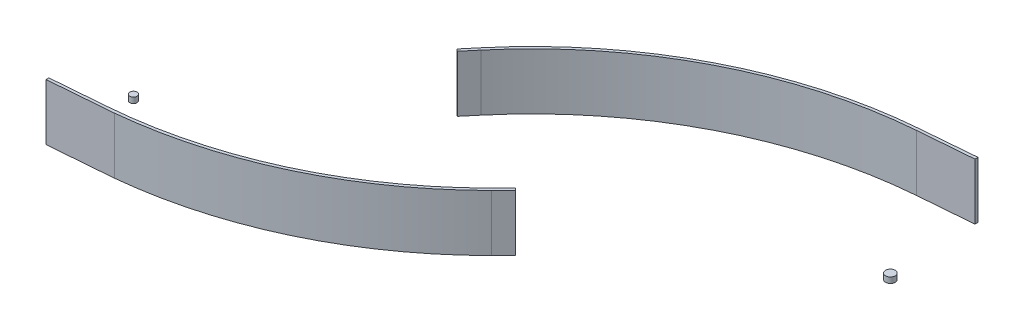
ISO-10303-21;
HEADER;
FILE_DESCRIPTION(('STEP AP214'),'2;1');
FILE_NAME('part.step','',(''),(''),'','','');
FILE_SCHEMA(('AUTOMOTIVE_DESIGN { 1 0 10303 214 1 1 1 1 }'));
ENDSEC;
DATA;
#1=APPLICATION_CONTEXT('core data for automotive mechanical design processes');
#2=APPLICATION_PROTOCOL_DEFINITION('international standard','automotive_design',2000,#1);
#3=PRODUCT_CONTEXT('',#1,'mechanical');
#4=PRODUCT('Part','Part','',(#3));
#5=PRODUCT_RELATED_PRODUCT_CATEGORY('part','',(#4));
#6=PRODUCT_DEFINITION_FORMATION('','',#4);
#7=PRODUCT_DEFINITION_CONTEXT('part definition',#1,'design');
#8=PRODUCT_DEFINITION('design','',#6,#7);
#9=PRODUCT_DEFINITION_SHAPE('','',#8);
#10=(LENGTH_UNIT() NAMED_UNIT(*) SI_UNIT(.MILLI.,.METRE.));
#11=(NAMED_UNIT(*) PLANE_ANGLE_UNIT() SI_UNIT($,.RADIAN.));
#12=(NAMED_UNIT(*) SI_UNIT($,.STERADIAN.) SOLID_ANGLE_UNIT());
#13=UNCERTAINTY_MEASURE_WITH_UNIT(LENGTH_MEASURE(1.E-05),#10,'distance_accuracy_value','');
#14=(GEOMETRIC_REPRESENTATION_CONTEXT(3) GLOBAL_UNCERTAINTY_ASSIGNED_CONTEXT((#13)) GLOBAL_UNIT_ASSIGNED_CONTEXT((#10,
#11,#12)) REPRESENTATION_CONTEXT('',''));
#15=CARTESIAN_POINT('',(0.,0.,0.));
#16=DIRECTION('',(0.,0.,1.));
#17=DIRECTION('',(1.,0.,0.));
#18=AXIS2_PLACEMENT_3D('',#15,#16,#17);
#19=CARTESIAN_POINT('',(-35.9480124731052,10.,598.554252565546));
#20=DIRECTION('',(0.,-1.,0.));
#21=DIRECTION('',(0.,0.,-1.));
#22=AXIS2_PLACEMENT_3D('',#19,#20,#21);
#23=CYLINDRICAL_SURFACE('',#22,6.41660394756342);
#24=CARTESIAN_POINT('',(-35.9480124731052,-10.,598.554252565546));
#25=DIRECTION('',(0.,-1.,0.));
#26=DIRECTION('',(0.,0.,-1.));
#27=AXIS2_PLACEMENT_3D('',#24,#25,#26);
#28=CIRCLE('',#27,6.41660394756341);
#29=CARTESIAN_POINT('',(-35.9480124731052,-10.,592.137648617983));
#30=VERTEX_POINT('',#29);
#31=EDGE_CURVE('E11',#30,#30,#28,.T.);
#32=ORIENTED_EDGE('',*,*,#31,.F.);
#33=EDGE_LOOP('',(#32));
#34=FACE_BOUND('',#33,.T.);
#35=CARTESIAN_POINT('',(-35.9480124731052,0.,598.554252565546));
#36=DIRECTION('',(0.,1.,0.));
#37=DIRECTION('',(0.,0.,1.));
#38=AXIS2_PLACEMENT_3D('',#35,#36,#37);
#39=CIRCLE('',#38,6.41660394756341);
#40=CARTESIAN_POINT('',(-35.9480124731052,0.,604.97085651311));
#41=VERTEX_POINT('',#40);
#42=EDGE_CURVE('E46',#41,#41,#39,.T.);
#43=ORIENTED_EDGE('',*,*,#42,.F.);
#44=EDGE_LOOP('',(#43));
#45=FACE_BOUND('',#44,.T.);
#46=ADVANCED_FACE('F40',(#34,#45),#23,.T.);
#47=CARTESIAN_POINT('',(-35.9480124731052,-10.,598.554252565546));
#48=DIRECTION('',(0.,-1.,0.));
#49=DIRECTION('',(0.,0.,-1.));
#50=AXIS2_PLACEMENT_3D('',#47,#48,#49);
#51=PLANE('',#50);
#52=ORIENTED_EDGE('',*,*,#31,.T.);
#53=EDGE_LOOP('',(#52));
#54=FACE_BOUND('',#53,.T.);
#55=ADVANCED_FACE('F55',(#54),#51,.T.);
#56=CARTESIAN_POINT('',(-35.9480124731052,0.,598.554252565546));
#57=DIRECTION('',(0.,1.,0.));
#58=DIRECTION('',(0.,0.,1.));
#59=AXIS2_PLACEMENT_3D('',#56,#57,#58);
#60=PLANE('',#59);
#61=ORIENTED_EDGE('',*,*,#42,.T.);
#62=EDGE_LOOP('',(#61));
#63=FACE_BOUND('',#62,.T.);
#64=ADVANCED_FACE('F52',(#63),#60,.T.);
#65=CLOSED_SHELL('',(#46,#55,#64));
#66=MANIFOLD_SOLID_BREP('B2',#65);
#67=CARTESIAN_POINT('',(909.895902728382,10.,202.105727747793));
#68=DIRECTION('',(0.,-1.,0.));
#69=DIRECTION('',(0.,0.,-1.));
#70=AXIS2_PLACEMENT_3D('',#67,#68,#69);
#71=CYLINDRICAL_SURFACE('',#70,8.59707885973202);
#72=CARTESIAN_POINT('',(909.895902728382,-10.,202.105727747793));
#73=DIRECTION('',(0.,-1.,0.));
#74=DIRECTION('',(0.,0.,-1.));
#75=AXIS2_PLACEMENT_3D('',#72,#73,#74);
#76=CIRCLE('',#75,8.59707885973202);
#77=CARTESIAN_POINT('',(909.895902728382,-10.,193.508648888061));
#78=VERTEX_POINT('',#77);
#79=EDGE_CURVE('E39',#78,#78,#76,.T.);
#80=ORIENTED_EDGE('',*,*,#79,.F.);
#81=EDGE_LOOP('',(#80));
#82=FACE_BOUND('',#81,.T.);
#83=CARTESIAN_POINT('',(909.895902728382,0.,202.105727747793));
#84=DIRECTION('',(0.,1.,0.));
#85=DIRECTION('',(0.,0.,1.));
#86=AXIS2_PLACEMENT_3D('',#83,#84,#85);
#87=CIRCLE('',#86,8.59707885973202);
#88=CARTESIAN_POINT('',(909.895902728382,0.,210.702806607525));
#89=VERTEX_POINT('',#88);
#90=EDGE_CURVE('E100',#89,#89,#87,.T.);
#91=ORIENTED_EDGE('',*,*,#90,.F.);
#92=EDGE_LOOP('',(#91));
#93=FACE_BOUND('',#92,.T.);
#94=ADVANCED_FACE('F94',(#82,#93),#71,.T.);
#95=CARTESIAN_POINT('',(909.895902728382,-10.,202.105727747793));
#96=DIRECTION('',(0.,-1.,0.));
#97=DIRECTION('',(0.,0.,-1.));
#98=AXIS2_PLACEMENT_3D('',#95,#96,#97);
#99=PLANE('',#98);
#100=ORIENTED_EDGE('',*,*,#79,.T.);
#101=EDGE_LOOP('',(#100));
#102=FACE_BOUND('',#101,.T.);
#103=ADVANCED_FACE('F109',(#102),#99,.T.);
#104=CARTESIAN_POINT('',(909.895902728382,0.,202.105727747793));
#105=DIRECTION('',(0.,1.,0.));
#106=DIRECTION('',(0.,0.,1.));
#107=AXIS2_PLACEMENT_3D('',#104,#105,#106);
#108=PLANE('',#107);
#109=ORIENTED_EDGE('',*,*,#90,.T.);
#110=EDGE_LOOP('',(#109));
#111=FACE_BOUND('',#110,.T.);
#112=ADVANCED_FACE('F106',(#111),#108,.T.);
#113=CLOSED_SHELL('',(#94,#103,#112));
#114=MANIFOLD_SOLID_BREP('B6',#113);
#115=CARTESIAN_POINT('',(60.,100.,740.782905923565));
#116=DIRECTION('',(0.0807310144380588,0.,0.996735924559661));
#117=DIRECTION('',(0.996735924559661,0.,-0.0807310144380588));
#118=AXIS2_PLACEMENT_3D('',#115,#116,#117);
#119=PLANE('',#118);
#120=DIRECTION('',(-0.996735924559661,0.,0.0807310144380588));
#121=VECTOR('',#120,1.);
#122=CARTESIAN_POINT('',(60.,0.,740.782905923565));
#123=LINE('',#122,#121);
#124=CARTESIAN_POINT('',(60.,0.,740.782905923565));
#125=VERTEX_POINT('',#124);
#126=CARTESIAN_POINT('',(-35.9480124731052,0.,748.554252565546));
#127=VERTEX_POINT('',#126);
#128=EDGE_CURVE('E92',#125,#127,#123,.T.);
#129=ORIENTED_EDGE('',*,*,#128,.T.);
#130=DIRECTION('',(0.,-1.,0.));
#131=VECTOR('',#130,1.);
#132=CARTESIAN_POINT('',(-35.9480124731052,100.,748.554252565546));
#133=LINE('',#132,#131);
#134=CARTESIAN_POINT('',(-35.9480124731052,100.,748.554252565546));
#135=VERTEX_POINT('',#134);
#136=EDGE_CURVE('E369',#135,#127,#133,.T.);
#137=ORIENTED_EDGE('',*,*,#136,.F.);
#138=DIRECTION('',(-0.996735924559661,0.,0.0807310144380588));
#139=VECTOR('',#138,1.);
#140=CARTESIAN_POINT('',(60.,100.,740.782905923565));
#141=LINE('',#140,#139);
#142=CARTESIAN_POINT('',(60.,100.,740.782905923565));
#143=VERTEX_POINT('',#142);
#144=EDGE_CURVE('E151',#143,#135,#141,.T.);
#145=ORIENTED_EDGE('',*,*,#144,.F.);
#146=DIRECTION('',(0.,-1.,0.));
#147=VECTOR('',#146,1.);
#148=CARTESIAN_POINT('',(60.,100.,740.782905923565));
#149=LINE('',#148,#147);
#150=EDGE_CURVE('E204',#143,#125,#149,.T.);
#151=ORIENTED_EDGE('',*,*,#150,.T.);
#152=EDGE_LOOP('',(#129,#137,#145,#151));
#153=FACE_BOUND('',#152,.T.);
#154=ADVANCED_FACE('F147',(#153),#119,.F.);
#155=CARTESIAN_POINT('',(-35.9480124731052,100.,748.554252565546));
#156=DIRECTION('',(1.,0.,0.));
#157=DIRECTION('',(0.,0.,-1.));
#158=AXIS2_PLACEMENT_3D('',#155,#156,#157);
#159=PLANE('',#158);
#160=DIRECTION('',(0.,0.,1.));
#161=VECTOR('',#160,1.);
#162=CARTESIAN_POINT('',(-35.9480124731052,0.,748.554252565546));
#163=LINE('',#162,#161);
#164=CARTESIAN_POINT('',(-35.9480124731052,0.,753.57062638814));
#165=VERTEX_POINT('',#164);
#166=EDGE_CURVE('E157',#127,#165,#163,.T.);
#167=ORIENTED_EDGE('',*,*,#166,.T.);
#168=DIRECTION('',(0.,-1.,0.));
#169=VECTOR('',#168,1.);
#170=CARTESIAN_POINT('',(-35.9480124731052,100.,753.57062638814));
#171=LINE('',#170,#169);
#172=CARTESIAN_POINT('',(-35.9480124731052,100.,753.57062638814));
#173=VERTEX_POINT('',#172);
#174=EDGE_CURVE('E230',#173,#165,#171,.T.);
#175=ORIENTED_EDGE('',*,*,#174,.F.);
#176=DIRECTION('',(0.,0.,1.));
#177=VECTOR('',#176,1.);
#178=CARTESIAN_POINT('',(-35.9480124731052,100.,748.554252565546));
#179=LINE('',#178,#177);
#180=EDGE_CURVE('E195',#135,#173,#179,.T.);
#181=ORIENTED_EDGE('',*,*,#180,.F.);
#182=ORIENTED_EDGE('',*,*,#136,.T.);
#183=EDGE_LOOP('',(#167,#175,#181,#182));
#184=FACE_BOUND('',#183,.T.);
#185=ADVANCED_FACE('F297',(#184),#159,.F.);
#186=CARTESIAN_POINT('',(76.3113829359843,100.,744.47813293198));
#187=DIRECTION('',(0.0807310144380543,0.,0.996735924559661));
#188=DIRECTION('',(0.996735924559661,0.,-0.0807310144380543));
#189=AXIS2_PLACEMENT_3D('',#186,#187,#188);
#190=PLANE('',#189);
#191=DIRECTION('',(-0.996735924559661,0.,0.0807310144380543));
#192=VECTOR('',#191,1.);
#193=CARTESIAN_POINT('',(76.3113829359843,0.,744.47813293198));
#194=LINE('',#193,#192);
#195=CARTESIAN_POINT('',(76.3113829359843,0.,744.478132931981));
#196=VERTEX_POINT('',#195);
#197=EDGE_CURVE('E234',#196,#165,#194,.T.);
#198=ORIENTED_EDGE('',*,*,#197,.F.);
#199=DIRECTION('',(0.,-1.,0.));
#200=VECTOR('',#199,1.);
#201=CARTESIAN_POINT('',(76.3113829359843,100.,744.478132931981));
#202=LINE('',#201,#200);
#203=CARTESIAN_POINT('',(76.3113829359843,100.,744.478132931981));
#204=VERTEX_POINT('',#203);
#205=EDGE_CURVE('E219',#204,#196,#202,.T.);
#206=ORIENTED_EDGE('',*,*,#205,.F.);
#207=DIRECTION('',(-0.996735924559661,0.,0.0807310144380543));
#208=VECTOR('',#207,1.);
#209=CARTESIAN_POINT('',(76.3113829359843,100.,744.47813293198));
#210=LINE('',#209,#208);
#211=EDGE_CURVE('E256',#204,#173,#210,.T.);
#212=ORIENTED_EDGE('',*,*,#211,.T.);
#213=ORIENTED_EDGE('',*,*,#174,.T.);
#214=EDGE_LOOP('',(#198,#206,#212,#213));
#215=FACE_BOUND('',#214,.T.);
#216=ADVANCED_FACE('F239',(#215),#190,.T.);
#217=CARTESIAN_POINT('',(0.,100.,0.));
#218=DIRECTION('',(0.,-1.,0.));
#219=DIRECTION('',(0.,0.,-1.));
#220=AXIS2_PLACEMENT_3D('',#217,#218,#219);
#221=CYLINDRICAL_SURFACE('',#220,748.378993277798);
#222=CARTESIAN_POINT('',(0.,0.,0.));
#223=DIRECTION('',(0.,1.,0.));
#224=DIRECTION('',(0.,0.,1.));
#225=AXIS2_PLACEMENT_3D('',#222,#223,#224);
#226=CIRCLE('',#225,748.378993277798);
#227=CARTESIAN_POINT('',(529.486382869139,0.,528.881166175962));
#228=VERTEX_POINT('',#227);
#229=EDGE_CURVE('E223',#196,#228,#226,.T.);
#230=ORIENTED_EDGE('',*,*,#229,.T.);
#231=DIRECTION('',(0.,-1.,0.));
#232=VECTOR('',#231,1.);
#233=CARTESIAN_POINT('',(529.486382869139,100.,528.881166175962));
#234=LINE('',#233,#232);
#235=CARTESIAN_POINT('',(529.486382869139,100.,528.881166175962));
#236=VERTEX_POINT('',#235);
#237=EDGE_CURVE('E229',#236,#228,#234,.T.);
#238=ORIENTED_EDGE('',*,*,#237,.F.);
#239=CARTESIAN_POINT('',(0.,100.,0.));
#240=DIRECTION('',(0.,1.,0.));
#241=DIRECTION('',(0.,0.,1.));
#242=AXIS2_PLACEMENT_3D('',#239,#240,#241);
#243=CIRCLE('',#242,748.378993277798);
#244=EDGE_CURVE('E225',#204,#236,#243,.T.);
#245=ORIENTED_EDGE('',*,*,#244,.F.);
#246=ORIENTED_EDGE('',*,*,#205,.T.);
#247=EDGE_LOOP('',(#230,#238,#245,#246));
#248=FACE_BOUND('',#247,.T.);
#249=ADVANCED_FACE('F221',(#248),#221,.T.);
#250=CARTESIAN_POINT('',(529.486382869139,100.,528.881166175962));
#251=DIRECTION('',(-0.707511017312316,0.,-0.706702313836379));
#252=DIRECTION('',(-0.706702313836379,0.,0.707511017312316));
#253=AXIS2_PLACEMENT_3D('',#250,#251,#252);
#254=PLANE('',#253);
#255=DIRECTION('',(0.706702313836379,0.,-0.707511017312316));
#256=VECTOR('',#255,1.);
#257=CARTESIAN_POINT('',(529.486382869139,0.,528.881166175962));
#258=LINE('',#257,#256);
#259=CARTESIAN_POINT('',(550.68745228423,0.,507.655835656593));
#260=VERTEX_POINT('',#259);
#261=EDGE_CURVE('E237',#228,#260,#258,.T.);
#262=ORIENTED_EDGE('',*,*,#261,.T.);
#263=DIRECTION('',(0.,-1.,0.));
#264=VECTOR('',#263,1.);
#265=CARTESIAN_POINT('',(550.68745228423,100.,507.655835656593));
#266=LINE('',#265,#264);
#267=CARTESIAN_POINT('',(550.68745228423,100.,507.655835656593));
#268=VERTEX_POINT('',#267);
#269=EDGE_CURVE('E274',#268,#260,#266,.T.);
#270=ORIENTED_EDGE('',*,*,#269,.F.);
#271=DIRECTION('',(0.706702313836379,0.,-0.707511017312316));
#272=VECTOR('',#271,1.);
#273=CARTESIAN_POINT('',(529.486382869139,100.,528.881166175962));
#274=LINE('',#273,#272);
#275=EDGE_CURVE('E253',#236,#268,#274,.T.);
#276=ORIENTED_EDGE('',*,*,#275,.F.);
#277=ORIENTED_EDGE('',*,*,#237,.T.);
#278=EDGE_LOOP('',(#262,#270,#276,#277));
#279=FACE_BOUND('',#278,.T.);
#280=ADVANCED_FACE('F272',(#279),#254,.F.);
#281=CARTESIAN_POINT('',(547.029480394755,100.,504.002044924031));
#282=DIRECTION('',(0.706702313836383,0.,-0.707511017312311));
#283=DIRECTION('',(-0.707511017312311,0.,-0.706702313836383));
#284=AXIS2_PLACEMENT_3D('',#281,#282,#283);
#285=PLANE('',#284);
#286=DIRECTION('',(0.707511017312311,0.,0.706702313836383));
#287=VECTOR('',#286,1.);
#288=CARTESIAN_POINT('',(547.029480394755,0.,504.002044924031));
#289=LINE('',#288,#287);
#290=CARTESIAN_POINT('',(547.029480394755,0.,504.002044924031));
#291=VERTEX_POINT('',#290);
#292=EDGE_CURVE('E265',#291,#260,#289,.T.);
#293=ORIENTED_EDGE('',*,*,#292,.F.);
#294=DIRECTION('',(0.,-1.,0.));
#295=VECTOR('',#294,1.);
#296=CARTESIAN_POINT('',(547.029480394755,100.,504.002044924031));
#297=LINE('',#296,#295);
#298=CARTESIAN_POINT('',(547.029480394755,100.,504.002044924031));
#299=VERTEX_POINT('',#298);
#300=EDGE_CURVE('E279',#299,#291,#297,.T.);
#301=ORIENTED_EDGE('',*,*,#300,.F.);
#302=DIRECTION('',(0.707511017312311,0.,0.706702313836383));
#303=VECTOR('',#302,1.);
#304=CARTESIAN_POINT('',(547.029480394755,100.,504.002044924031));
#305=LINE('',#304,#303);
#306=EDGE_CURVE('E250',#299,#268,#305,.T.);
#307=ORIENTED_EDGE('',*,*,#306,.T.);
#308=ORIENTED_EDGE('',*,*,#269,.T.);
#309=EDGE_LOOP('',(#293,#301,#307,#308));
#310=FACE_BOUND('',#309,.T.);
#311=ADVANCED_FACE('F278',(#310),#285,.T.);
#312=CARTESIAN_POINT('',(525.828410979663,100.,525.227375443401));
#313=DIRECTION('',(-0.707511017312312,0.,-0.706702313836383));
#314=DIRECTION('',(-0.706702313836383,0.,0.707511017312312));
#315=AXIS2_PLACEMENT_3D('',#312,#313,#314);
#316=PLANE('',#315);
#317=DIRECTION('',(0.706702313836383,0.,-0.707511017312312));
#318=VECTOR('',#317,1.);
#319=CARTESIAN_POINT('',(525.828410979663,0.,525.227375443401));
#320=LINE('',#319,#318);
#321=CARTESIAN_POINT('',(525.828410979663,0.,525.227375443401));
#322=VERTEX_POINT('',#321);
#323=EDGE_CURVE('E261',#322,#291,#320,.T.);
#324=ORIENTED_EDGE('',*,*,#323,.F.);
#325=DIRECTION('',(0.,-1.,0.));
#326=VECTOR('',#325,1.);
#327=CARTESIAN_POINT('',(525.828410979663,100.,525.227375443401));
#328=LINE('',#327,#326);
#329=CARTESIAN_POINT('',(525.828410979663,100.,525.227375443401));
#330=VERTEX_POINT('',#329);
#331=EDGE_CURVE('E282',#330,#322,#328,.T.);
#332=ORIENTED_EDGE('',*,*,#331,.F.);
#333=DIRECTION('',(0.706702313836383,0.,-0.707511017312312));
#334=VECTOR('',#333,1.);
#335=CARTESIAN_POINT('',(525.828410979663,100.,525.227375443401));
#336=LINE('',#335,#334);
#337=EDGE_CURVE('E247',#330,#299,#336,.T.);
#338=ORIENTED_EDGE('',*,*,#337,.T.);
#339=ORIENTED_EDGE('',*,*,#300,.T.);
#340=EDGE_LOOP('',(#324,#332,#338,#339));
#341=FACE_BOUND('',#340,.T.);
#342=ADVANCED_FACE('F289',(#341),#316,.T.);
#343=CARTESIAN_POINT('',(0.,100.,0.));
#344=DIRECTION('',(0.,-1.,0.));
#345=DIRECTION('',(0.,0.,-1.));
#346=AXIS2_PLACEMENT_3D('',#343,#344,#345);
#347=CYLINDRICAL_SURFACE('',#346,743.2087955);
#348=CARTESIAN_POINT('',(0.,0.,0.));
#349=DIRECTION('',(0.,1.,0.));
#350=DIRECTION('',(0.,0.,1.));
#351=AXIS2_PLACEMENT_3D('',#348,#349,#350);
#352=CIRCLE('',#351,743.2087955);
#353=EDGE_CURVE('E257',#125,#322,#352,.T.);
#354=ORIENTED_EDGE('',*,*,#353,.F.);
#355=ORIENTED_EDGE('',*,*,#150,.F.);
#356=CARTESIAN_POINT('',(0.,100.,0.));
#357=DIRECTION('',(0.,1.,0.));
#358=DIRECTION('',(0.,0.,1.));
#359=AXIS2_PLACEMENT_3D('',#356,#357,#358);
#360=CIRCLE('',#359,743.2087955);
#361=EDGE_CURVE('E244',#143,#330,#360,.T.);
#362=ORIENTED_EDGE('',*,*,#361,.T.);
#363=ORIENTED_EDGE('',*,*,#331,.T.);
#364=EDGE_LOOP('',(#354,#355,#362,#363));
#365=FACE_BOUND('',#364,.T.);
#366=ADVANCED_FACE('F286',(#365),#347,.F.);
#367=CARTESIAN_POINT('',(0.,100.,0.));
#368=DIRECTION('',(0.,1.,0.));
#369=DIRECTION('',(0.,0.,1.));
#370=AXIS2_PLACEMENT_3D('',#367,#368,#369);
#371=PLANE('',#370);
#372=ORIENTED_EDGE('',*,*,#144,.T.);
#373=ORIENTED_EDGE('',*,*,#180,.T.);
#374=ORIENTED_EDGE('',*,*,#211,.F.);
#375=ORIENTED_EDGE('',*,*,#244,.T.);
#376=ORIENTED_EDGE('',*,*,#275,.T.);
#377=ORIENTED_EDGE('',*,*,#306,.F.);
#378=ORIENTED_EDGE('',*,*,#337,.F.);
#379=ORIENTED_EDGE('',*,*,#361,.F.);
#380=EDGE_LOOP('',(#372,#373,#374,#375,#376,#377,#378,#379));
#381=FACE_BOUND('',#380,.T.);
#382=ADVANCED_FACE('F149',(#381),#371,.T.);
#383=CARTESIAN_POINT('',(0.,0.,0.));
#384=DIRECTION('',(0.,1.,0.));
#385=DIRECTION('',(0.,0.,1.));
#386=AXIS2_PLACEMENT_3D('',#383,#384,#385);
#387=PLANE('',#386);
#388=ORIENTED_EDGE('',*,*,#128,.F.);
#389=ORIENTED_EDGE('',*,*,#353,.T.);
#390=ORIENTED_EDGE('',*,*,#323,.T.);
#391=ORIENTED_EDGE('',*,*,#292,.T.);
#392=ORIENTED_EDGE('',*,*,#261,.F.);
#393=ORIENTED_EDGE('',*,*,#229,.F.);
#394=ORIENTED_EDGE('',*,*,#197,.T.);
#395=ORIENTED_EDGE('',*,*,#166,.F.);
#396=EDGE_LOOP('',(#388,#389,#390,#391,#392,#393,#394,#395));
#397=FACE_BOUND('',#396,.T.);
#398=ADVANCED_FACE('F233',(#397),#387,.F.);
#399=CLOSED_SHELL('',(#154,#185,#216,#249,#280,#311,#342,#366,#382,#398));
#400=MANIFOLD_SOLID_BREP('B34',#399);
#401=CARTESIAN_POINT('',(813.230028037393,100.,54.9188440971249));
#402=DIRECTION('',(-0.0840458275579732,0.,-0.996461890325012));
#403=DIRECTION('',(-0.996461890325012,0.,0.0840458275579732));
#404=AXIS2_PLACEMENT_3D('',#401,#402,#403);
#405=PLANE('',#404);
#406=DIRECTION('',(0.996461890325012,0.,-0.0840458275579732));
#407=VECTOR('',#406,1.);
#408=CARTESIAN_POINT('',(813.230028037393,0.,54.9188440971249));
#409=LINE('',#408,#407);
#410=CARTESIAN_POINT('',(813.230028037394,0.,54.9188440971251));
#411=VERTEX_POINT('',#410);
#412=CARTESIAN_POINT('',(909.895902728382,0.,46.765633709551));
#413=VERTEX_POINT('',#412);
#414=EDGE_CURVE('E474',#411,#413,#409,.T.);
#415=ORIENTED_EDGE('',*,*,#414,.F.);
#416=DIRECTION('',(0.,-1.,0.));
#417=VECTOR('',#416,1.);
#418=CARTESIAN_POINT('',(813.230028037394,100.,54.9188440971251));
#419=LINE('',#418,#417);
#420=CARTESIAN_POINT('',(813.230028037394,100.,54.9188440971251));
#421=VERTEX_POINT('',#420);
#422=EDGE_CURVE('E145',#421,#411,#419,.T.);
#423=ORIENTED_EDGE('',*,*,#422,.F.);
#424=DIRECTION('',(0.996461890325012,0.,-0.0840458275579732));
#425=VECTOR('',#424,1.);
#426=CARTESIAN_POINT('',(813.230028037393,100.,54.9188440971249));
#427=LINE('',#426,#425);
#428=CARTESIAN_POINT('',(909.895902728382,100.,46.765633709551));
#429=VERTEX_POINT('',#428);
#430=EDGE_CURVE('E492',#421,#429,#427,.T.);
#431=ORIENTED_EDGE('',*,*,#430,.T.);
#432=DIRECTION('',(0.,-1.,0.));
#433=VECTOR('',#432,1.);
#434=CARTESIAN_POINT('',(909.895902728382,100.,46.765633709551));
#435=LINE('',#434,#433);
#436=EDGE_CURVE('E378',#429,#413,#435,.T.);
#437=ORIENTED_EDGE('',*,*,#436,.T.);
#438=EDGE_LOOP('',(#415,#423,#431,#437));
#439=FACE_BOUND('',#438,.T.);
#440=ADVANCED_FACE('F375',(#439),#405,.T.);
#441=CARTESIAN_POINT('',(873.633683109583,100.,800.685429643488));
#442=DIRECTION('',(0.,-1.,0.));
#443=DIRECTION('',(0.,0.,-1.));
#444=AXIS2_PLACEMENT_3D('',#441,#442,#443);
#445=CYLINDRICAL_SURFACE('',#444,748.2087955);
#446=CARTESIAN_POINT('',(873.633683109583,0.,800.685429643488));
#447=DIRECTION('',(0.,1.,0.));
#448=DIRECTION('',(0.,0.,1.));
#449=AXIS2_PLACEMENT_3D('',#446,#447,#448);
#450=CIRCLE('',#449,748.2087955);
#451=CARTESIAN_POINT('',(300.836036258645,0.,319.313164732443));
#452=VERTEX_POINT('',#451);
#453=EDGE_CURVE('E420',#411,#452,#450,.T.);
#454=ORIENTED_EDGE('',*,*,#453,.T.);
#455=DIRECTION('',(0.,-1.,0.));
#456=VECTOR('',#455,1.);
#457=CARTESIAN_POINT('',(300.836036258645,100.,319.313164732443));
#458=LINE('',#457,#456);
#459=CARTESIAN_POINT('',(300.836036258645,100.,319.313164732443));
#460=VERTEX_POINT('',#459);
#461=EDGE_CURVE('E384',#460,#452,#458,.T.);
#462=ORIENTED_EDGE('',*,*,#461,.F.);
#463=CARTESIAN_POINT('',(873.633683109583,100.,800.685429643488));
#464=DIRECTION('',(0.,1.,0.));
#465=DIRECTION('',(0.,0.,1.));
#466=AXIS2_PLACEMENT_3D('',#463,#464,#465);
#467=CIRCLE('',#466,748.2087955);
#468=EDGE_CURVE('E453',#421,#460,#467,.T.);
#469=ORIENTED_EDGE('',*,*,#468,.F.);
#470=ORIENTED_EDGE('',*,*,#422,.T.);
#471=EDGE_LOOP('',(#454,#462,#469,#470));
#472=FACE_BOUND('',#471,.T.);
#473=ADVANCED_FACE('F529',(#472),#445,.T.);
#474=CARTESIAN_POINT('',(300.836036258645,100.,319.313164732444));
#475=DIRECTION('',(0.765558558380965,0.,0.643366220507153));
#476=DIRECTION('',(0.643366220507153,0.,-0.765558558380965));
#477=AXIS2_PLACEMENT_3D('',#474,#475,#476);
#478=PLANE('',#477);
#479=DIRECTION('',(-0.643366220507153,0.,0.765558558380965));
#480=VECTOR('',#479,1.);
#481=CARTESIAN_POINT('',(300.836036258645,0.,319.313164732444));
#482=LINE('',#481,#480);
#483=CARTESIAN_POINT('',(281.535049643431,0.,342.279921483873));
#484=VERTEX_POINT('',#483);
#485=EDGE_CURVE('E460',#452,#484,#482,.T.);
#486=ORIENTED_EDGE('',*,*,#485,.T.);
#487=DIRECTION('',(0.,-1.,0.));
#488=VECTOR('',#487,1.);
#489=CARTESIAN_POINT('',(281.535049643431,100.,342.279921483873));
#490=LINE('',#489,#488);
#491=CARTESIAN_POINT('',(281.535049643431,100.,342.279921483873));
#492=VERTEX_POINT('',#491);
#493=EDGE_CURVE('E457',#492,#484,#490,.T.);
#494=ORIENTED_EDGE('',*,*,#493,.F.);
#495=DIRECTION('',(-0.643366220507153,0.,0.765558558380965));
#496=VECTOR('',#495,1.);
#497=CARTESIAN_POINT('',(300.836036258645,100.,319.313164732444));
#498=LINE('',#497,#496);
#499=EDGE_CURVE('E445',#460,#492,#498,.T.);
#500=ORIENTED_EDGE('',*,*,#499,.F.);
#501=ORIENTED_EDGE('',*,*,#461,.T.);
#502=EDGE_LOOP('',(#486,#494,#500,#501));
#503=FACE_BOUND('',#502,.T.);
#504=ADVANCED_FACE('F458',(#503),#478,.F.);
#505=CARTESIAN_POINT('',(285.362842435335,100.,345.496752586408));
#506=DIRECTION('',(-0.643366220507149,0.,0.765558558380968));
#507=DIRECTION('',(0.765558558380968,0.,0.643366220507149));
#508=AXIS2_PLACEMENT_3D('',#505,#506,#507);
#509=PLANE('',#508);
#510=DIRECTION('',(-0.765558558380968,0.,-0.643366220507149));
#511=VECTOR('',#510,1.);
#512=CARTESIAN_POINT('',(285.362842435335,0.,345.496752586408));
#513=LINE('',#512,#511);
#514=CARTESIAN_POINT('',(285.362842435335,0.,345.496752586408));
#515=VERTEX_POINT('',#514);
#516=EDGE_CURVE('E489',#515,#484,#513,.T.);
#517=ORIENTED_EDGE('',*,*,#516,.F.);
#518=DIRECTION('',(0.,-1.,0.));
#519=VECTOR('',#518,1.);
#520=CARTESIAN_POINT('',(285.362842435335,100.,345.496752586408));
#521=LINE('',#520,#519);
#522=CARTESIAN_POINT('',(285.362842435335,100.,345.496752586408));
#523=VERTEX_POINT('',#522);
#524=EDGE_CURVE('E464',#523,#515,#521,.T.);
#525=ORIENTED_EDGE('',*,*,#524,.F.);
#526=DIRECTION('',(-0.765558558380968,0.,-0.643366220507149));
#527=VECTOR('',#526,1.);
#528=CARTESIAN_POINT('',(285.362842435335,100.,345.496752586408));
#529=LINE('',#528,#527);
#530=EDGE_CURVE('E451',#523,#492,#529,.T.);
#531=ORIENTED_EDGE('',*,*,#530,.T.);
#532=ORIENTED_EDGE('',*,*,#493,.T.);
#533=EDGE_LOOP('',(#517,#525,#531,#532));
#534=FACE_BOUND('',#533,.T.);
#535=ADVANCED_FACE('F466',(#534),#509,.T.);
#536=CARTESIAN_POINT('',(304.66382905055,100.,322.529995834979));
#537=DIRECTION('',(0.765558558380965,0.,0.643366220507153));
#538=DIRECTION('',(0.643366220507153,0.,-0.765558558380965));
#539=AXIS2_PLACEMENT_3D('',#536,#537,#538);
#540=PLANE('',#539);
#541=DIRECTION('',(-0.643366220507153,0.,0.765558558380965));
#542=VECTOR('',#541,1.);
#543=CARTESIAN_POINT('',(304.66382905055,0.,322.529995834979));
#544=LINE('',#543,#542);
#545=CARTESIAN_POINT('',(304.66382905055,0.,322.529995834979));
#546=VERTEX_POINT('',#545);
#547=EDGE_CURVE('E486',#546,#515,#544,.T.);
#548=ORIENTED_EDGE('',*,*,#547,.F.);
#549=DIRECTION('',(0.,-1.,0.));
#550=VECTOR('',#549,1.);
#551=CARTESIAN_POINT('',(304.66382905055,100.,322.529995834979));
#552=LINE('',#551,#550);
#553=CARTESIAN_POINT('',(304.66382905055,100.,322.529995834979));
#554=VERTEX_POINT('',#553);
#555=EDGE_CURVE('E496',#554,#546,#552,.T.);
#556=ORIENTED_EDGE('',*,*,#555,.F.);
#557=DIRECTION('',(-0.643366220507153,0.,0.765558558380965));
#558=VECTOR('',#557,1.);
#559=CARTESIAN_POINT('',(304.66382905055,100.,322.529995834979));
#560=LINE('',#559,#558);
#561=EDGE_CURVE('E467',#554,#523,#560,.T.);
#562=ORIENTED_EDGE('',*,*,#561,.T.);
#563=ORIENTED_EDGE('',*,*,#524,.T.);
#564=EDGE_LOOP('',(#548,#556,#562,#563));
#565=FACE_BOUND('',#564,.T.);
#566=ADVANCED_FACE('F508',(#565),#540,.T.);
#567=CARTESIAN_POINT('',(873.633683109583,100.,800.685429643488));
#568=DIRECTION('',(0.,-1.,0.));
#569=DIRECTION('',(0.,0.,-1.));
#570=AXIS2_PLACEMENT_3D('',#567,#568,#569);
#571=CYLINDRICAL_SURFACE('',#570,743.2087955);
#572=CARTESIAN_POINT('',(873.633683109583,0.,800.685429643488));
#573=DIRECTION('',(0.,1.,0.));
#574=DIRECTION('',(0.,0.,1.));
#575=AXIS2_PLACEMENT_3D('',#572,#573,#574);
#576=CIRCLE('',#575,743.2087955);
#577=CARTESIAN_POINT('',(813.633683109584,0.,59.9025237199233));
#578=VERTEX_POINT('',#577);
#579=EDGE_CURVE('E483',#578,#546,#576,.T.);
#580=ORIENTED_EDGE('',*,*,#579,.F.);
#581=DIRECTION('',(0.,-1.,0.));
#582=VECTOR('',#581,1.);
#583=CARTESIAN_POINT('',(813.633683109584,100.,59.9025237199233));
#584=LINE('',#583,#582);
#585=CARTESIAN_POINT('',(813.633683109584,100.,59.9025237199233));
#586=VERTEX_POINT('',#585);
#587=EDGE_CURVE('E498',#586,#578,#584,.T.);
#588=ORIENTED_EDGE('',*,*,#587,.F.);
#589=CARTESIAN_POINT('',(873.633683109583,100.,800.685429643488));
#590=DIRECTION('',(0.,1.,0.));
#591=DIRECTION('',(0.,0.,1.));
#592=AXIS2_PLACEMENT_3D('',#589,#590,#591);
#593=CIRCLE('',#592,743.2087955);
#594=EDGE_CURVE('E469',#586,#554,#593,.T.);
#595=ORIENTED_EDGE('',*,*,#594,.T.);
#596=ORIENTED_EDGE('',*,*,#555,.T.);
#597=EDGE_LOOP('',(#580,#588,#595,#596));
#598=FACE_BOUND('',#597,.T.);
#599=ADVANCED_FACE('F512',(#598),#571,.F.);
#600=CARTESIAN_POINT('',(813.633683109584,100.,59.9025237199231));
#601=DIRECTION('',(-0.0807310144380542,0.,-0.996735924559661));
#602=DIRECTION('',(-0.996735924559661,0.,0.0807310144380542));
#603=AXIS2_PLACEMENT_3D('',#600,#601,#602);
#604=PLANE('',#603);
#605=DIRECTION('',(0.996735924559661,0.,-0.0807310144380542));
#606=VECTOR('',#605,1.);
#607=CARTESIAN_POINT('',(813.633683109584,0.,59.9025237199231));
#608=LINE('',#607,#606);
#609=CARTESIAN_POINT('',(909.895902728382,0.,52.1057277477928));
#610=VERTEX_POINT('',#609);
#611=EDGE_CURVE('E480',#578,#610,#608,.T.);
#612=ORIENTED_EDGE('',*,*,#611,.T.);
#613=DIRECTION('',(0.,-1.,0.));
#614=VECTOR('',#613,1.);
#615=CARTESIAN_POINT('',(909.895902728382,100.,52.1057277477928));
#616=LINE('',#615,#614);
#617=CARTESIAN_POINT('',(909.895902728382,100.,52.1057277477928));
#618=VERTEX_POINT('',#617);
#619=EDGE_CURVE('E499',#618,#610,#616,.T.);
#620=ORIENTED_EDGE('',*,*,#619,.F.);
#621=DIRECTION('',(0.996735924559661,0.,-0.0807310144380542));
#622=VECTOR('',#621,1.);
#623=CARTESIAN_POINT('',(813.633683109584,100.,59.9025237199231));
#624=LINE('',#623,#622);
#625=EDGE_CURVE('E514',#586,#618,#624,.T.);
#626=ORIENTED_EDGE('',*,*,#625,.F.);
#627=ORIENTED_EDGE('',*,*,#587,.T.);
#628=EDGE_LOOP('',(#612,#620,#626,#627));
#629=FACE_BOUND('',#628,.T.);
#630=ADVANCED_FACE('F520',(#629),#604,.F.);
#631=CARTESIAN_POINT('',(909.895902728382,100.,46.765633709551));
#632=DIRECTION('',(1.,0.,0.));
#633=DIRECTION('',(0.,0.,-1.));
#634=AXIS2_PLACEMENT_3D('',#631,#632,#633);
#635=PLANE('',#634);
#636=DIRECTION('',(0.,0.,1.));
#637=VECTOR('',#636,1.);
#638=CARTESIAN_POINT('',(909.895902728382,0.,46.765633709551));
#639=LINE('',#638,#637);
#640=EDGE_CURVE('E477',#413,#610,#639,.T.);
#641=ORIENTED_EDGE('',*,*,#640,.F.);
#642=ORIENTED_EDGE('',*,*,#436,.F.);
#643=DIRECTION('',(0.,0.,1.));
#644=VECTOR('',#643,1.);
#645=CARTESIAN_POINT('',(909.895902728382,100.,46.765633709551));
#646=LINE('',#645,#644);
#647=EDGE_CURVE('E515',#429,#618,#646,.T.);
#648=ORIENTED_EDGE('',*,*,#647,.T.);
#649=ORIENTED_EDGE('',*,*,#619,.T.);
#650=EDGE_LOOP('',(#641,#642,#648,#649));
#651=FACE_BOUND('',#650,.T.);
#652=ADVANCED_FACE('F501',(#651),#635,.T.);
#653=CARTESIAN_POINT('',(873.633683109583,100.,800.685429643488));
#654=DIRECTION('',(0.,1.,0.));
#655=DIRECTION('',(0.,0.,1.));
#656=AXIS2_PLACEMENT_3D('',#653,#654,#655);
#657=PLANE('',#656);
#658=ORIENTED_EDGE('',*,*,#430,.F.);
#659=ORIENTED_EDGE('',*,*,#468,.T.);
#660=ORIENTED_EDGE('',*,*,#499,.T.);
#661=ORIENTED_EDGE('',*,*,#530,.F.);
#662=ORIENTED_EDGE('',*,*,#561,.F.);
#663=ORIENTED_EDGE('',*,*,#594,.F.);
#664=ORIENTED_EDGE('',*,*,#625,.T.);
#665=ORIENTED_EDGE('',*,*,#647,.F.);
#666=EDGE_LOOP('',(#658,#659,#660,#661,#662,#663,#664,#665));
#667=FACE_BOUND('',#666,.T.);
#668=ADVANCED_FACE('F448',(#667),#657,.T.);
#669=CARTESIAN_POINT('',(873.633683109583,0.,800.685429643488));
#670=DIRECTION('',(0.,1.,0.));
#671=DIRECTION('',(0.,0.,1.));
#672=AXIS2_PLACEMENT_3D('',#669,#670,#671);
#673=PLANE('',#672);
#674=ORIENTED_EDGE('',*,*,#414,.T.);
#675=ORIENTED_EDGE('',*,*,#640,.T.);
#676=ORIENTED_EDGE('',*,*,#611,.F.);
#677=ORIENTED_EDGE('',*,*,#579,.T.);
#678=ORIENTED_EDGE('',*,*,#547,.T.);
#679=ORIENTED_EDGE('',*,*,#516,.T.);
#680=ORIENTED_EDGE('',*,*,#485,.F.);
#681=ORIENTED_EDGE('',*,*,#453,.F.);
#682=EDGE_LOOP('',(#674,#675,#676,#677,#678,#679,#680,#681));
#683=FACE_BOUND('',#682,.T.);
#684=ADVANCED_FACE('F504',(#683),#673,.F.);
#685=CLOSED_SHELL('',(#440,#473,#504,#535,#566,#599,#630,#652,#668,#684));
#686=MANIFOLD_SOLID_BREP('B86',#685);
#687=ADVANCED_BREP_SHAPE_REPRESENTATION('',(#18,#66,#114,#400,#686),#14);
#688=SHAPE_DEFINITION_REPRESENTATION(#9,#687);
ENDSEC;
END-ISO-10303-21;
